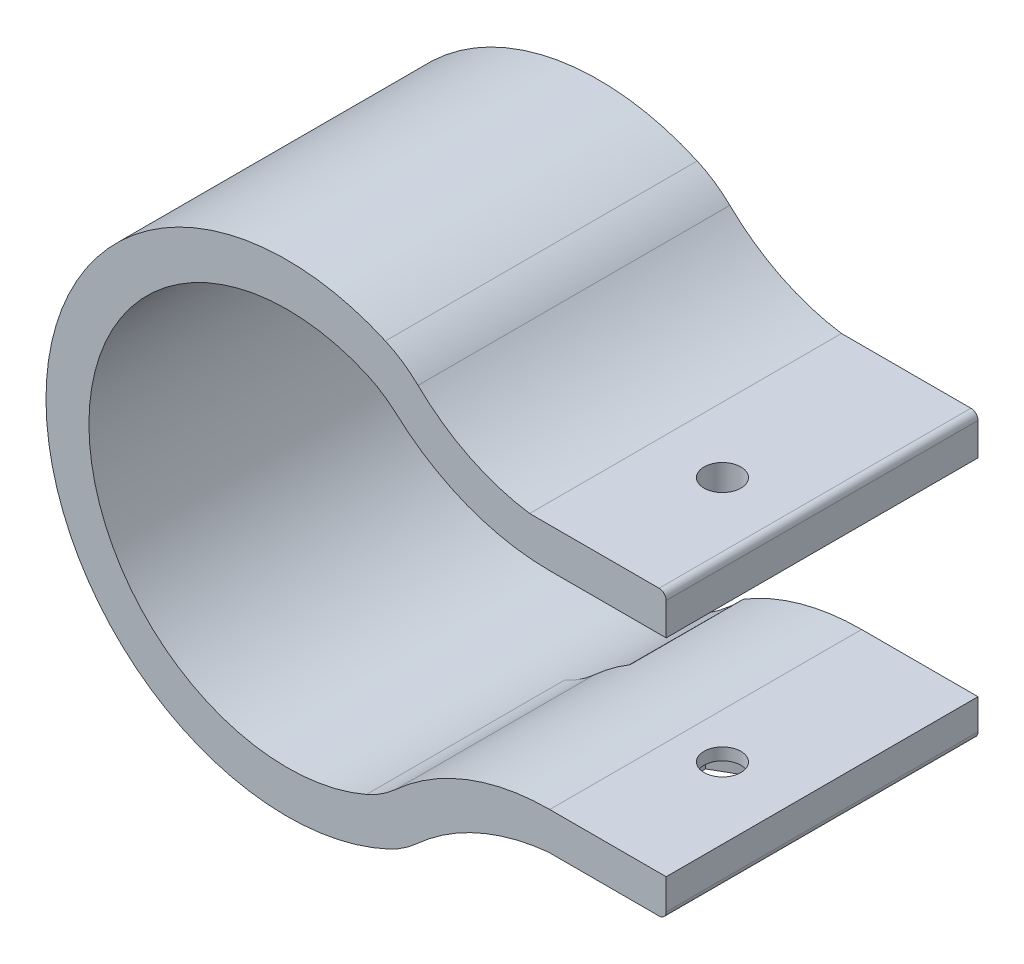
ISO-10303-21;
HEADER;
FILE_DESCRIPTION(('STEP AP214'),'2;1');
FILE_NAME('part.step','',(''),(''),'','','');
FILE_SCHEMA(('AUTOMOTIVE_DESIGN { 1 0 10303 214 1 1 1 1 }'));
ENDSEC;
DATA;
#1=APPLICATION_CONTEXT('core data for automotive mechanical design processes');
#2=APPLICATION_PROTOCOL_DEFINITION('international standard','automotive_design',2000,#1);
#3=PRODUCT_CONTEXT('',#1,'mechanical');
#4=PRODUCT('Part','Part','',(#3));
#5=PRODUCT_RELATED_PRODUCT_CATEGORY('part','',(#4));
#6=PRODUCT_DEFINITION_FORMATION('','',#4);
#7=PRODUCT_DEFINITION_CONTEXT('part definition',#1,'design');
#8=PRODUCT_DEFINITION('design','',#6,#7);
#9=PRODUCT_DEFINITION_SHAPE('','',#8);
#10=(LENGTH_UNIT() NAMED_UNIT(*) SI_UNIT(.MILLI.,.METRE.));
#11=(NAMED_UNIT(*) PLANE_ANGLE_UNIT() SI_UNIT($,.RADIAN.));
#12=(NAMED_UNIT(*) SI_UNIT($,.STERADIAN.) SOLID_ANGLE_UNIT());
#13=UNCERTAINTY_MEASURE_WITH_UNIT(LENGTH_MEASURE(1.E-05),#10,'distance_accuracy_value','');
#14=(GEOMETRIC_REPRESENTATION_CONTEXT(3) GLOBAL_UNCERTAINTY_ASSIGNED_CONTEXT((#13)) GLOBAL_UNIT_ASSIGNED_CONTEXT((#10,
#11,#12)) REPRESENTATION_CONTEXT('',''));
#15=CARTESIAN_POINT('',(0.,0.,0.));
#16=DIRECTION('',(0.,0.,1.));
#17=DIRECTION('',(1.,0.,0.));
#18=AXIS2_PLACEMENT_3D('',#15,#16,#17);
#19=CARTESIAN_POINT('',(0.,0.,0.));
#20=DIRECTION('',(0.,0.,1.));
#21=DIRECTION('',(1.,0.,0.));
#22=AXIS2_PLACEMENT_3D('',#19,#20,#21);
#23=PLANE('',#22);
#24=CARTESIAN_POINT('',(0.,0.,0.));
#25=DIRECTION('',(0.,0.,1.));
#26=DIRECTION('',(1.,0.,0.));
#27=AXIS2_PLACEMENT_3D('',#24,#25,#26);
#28=CIRCLE('',#27,14.);
#29=CARTESIAN_POINT('',(10.1763233301614,9.61469934423397,0.));
#30=VERTEX_POINT('',#29);
#31=CARTESIAN_POINT('',(5.5819491316693,12.8390748845646,0.));
#32=VERTEX_POINT('',#31);
#33=EDGE_CURVE('E182',#30,#32,#28,.T.);
#34=ORIENTED_EDGE('',*,*,#33,.F.);
#35=CARTESIAN_POINT('',(18.5109838464994,23.4286105601288,0.));
#36=DIRECTION('',(0.,0.,1.));
#37=DIRECTION('',(1.,0.,0.));
#38=AXIS2_PLACEMENT_3D('',#35,#36,#37);
#39=CIRCLE('',#38,16.1335274817143);
#40=CARTESIAN_POINT('',(7.64356227458687,11.504271694533,0.));
#41=VERTEX_POINT('',#40);
#42=EDGE_CURVE('E11',#41,#30,#39,.T.);
#43=ORIENTED_EDGE('',*,*,#42,.F.);
#44=CARTESIAN_POINT('',(2.59161923970361,5.96099905354783,0.));
#45=DIRECTION('',(0.,0.,1.));
#46=DIRECTION('',(1.,0.,0.));
#47=AXIS2_PLACEMENT_3D('',#44,#45,#46);
#48=CIRCLE('',#47,7.5);
#49=EDGE_CURVE('E272',#41,#32,#48,.T.);
#50=ORIENTED_EDGE('',*,*,#49,.T.);
#51=EDGE_LOOP('',(#34,#43,#50));
#52=FACE_BOUND('',#51,.T.);
#53=ADVANCED_FACE('F17',(#52),#23,.F.);
#54=CARTESIAN_POINT('',(2.59161923970361,-5.96099905354782,0.));
#55=DIRECTION('',(0.,0.,1.));
#56=DIRECTION('',(1.,0.,0.));
#57=AXIS2_PLACEMENT_3D('',#54,#55,#56);
#58=CIRCLE('',#57,7.5);
#59=CARTESIAN_POINT('',(5.58194913166929,-12.8390748845646,0.));
#60=VERTEX_POINT('',#59);
#61=CARTESIAN_POINT('',(7.64356227458687,-11.504271694533,0.));
#62=VERTEX_POINT('',#61);
#63=EDGE_CURVE('E266',#60,#62,#58,.T.);
#64=ORIENTED_EDGE('',*,*,#63,.T.);
#65=CARTESIAN_POINT('',(18.5109838464994,-23.4286105601288,0.));
#66=DIRECTION('',(0.,0.,1.));
#67=DIRECTION('',(1.,0.,0.));
#68=AXIS2_PLACEMENT_3D('',#65,#66,#67);
#69=CIRCLE('',#68,16.1335274817143);
#70=CARTESIAN_POINT('',(10.1763233301614,-9.61469934423397,0.));
#71=VERTEX_POINT('',#70);
#72=EDGE_CURVE('E27',#71,#62,#69,.T.);
#73=ORIENTED_EDGE('',*,*,#72,.F.);
#74=EDGE_CURVE('E194',#60,#71,#28,.T.);
#75=ORIENTED_EDGE('',*,*,#74,.F.);
#76=EDGE_LOOP('',(#64,#73,#75));
#77=FACE_BOUND('',#76,.T.);
#78=ADVANCED_FACE('F552',(#77),#23,.F.);
#79=CARTESIAN_POINT('',(21.6967618307602,30.1528672788031,5.));
#80=DIRECTION('',(0.,-1.,0.));
#81=DIRECTION('',(0.,0.,-1.));
#82=AXIS2_PLACEMENT_3D('',#79,#80,#81);
#83=CYLINDRICAL_SURFACE('',#82,1.3);
#84=CARTESIAN_POINT('',(21.6967618307602,-7.29508307841454,5.));
#85=DIRECTION('',(0.,1.,0.));
#86=DIRECTION('',(0.,0.,1.));
#87=AXIS2_PLACEMENT_3D('',#84,#85,#86);
#88=CIRCLE('',#87,1.3);
#89=CARTESIAN_POINT('',(21.6967618307602,-7.29508307841454,6.3));
#90=VERTEX_POINT('',#89);
#91=EDGE_CURVE('E258',#90,#90,#88,.T.);
#92=ORIENTED_EDGE('',*,*,#91,.T.);
#93=EDGE_LOOP('',(#92));
#94=FACE_BOUND('',#93,.T.);
#95=CARTESIAN_POINT('',(21.6967618307602,-8.1471327211969,5.));
#96=DIRECTION('',(0.,-1.,0.));
#97=DIRECTION('',(0.,0.,-1.));
#98=AXIS2_PLACEMENT_3D('',#95,#96,#97);
#99=CIRCLE('',#98,1.3);
#100=CARTESIAN_POINT('',(21.6967618307602,-8.1471327211969,3.7));
#101=VERTEX_POINT('',#100);
#102=EDGE_CURVE('E316',#101,#101,#99,.T.);
#103=ORIENTED_EDGE('',*,*,#102,.T.);
#104=EDGE_LOOP('',(#103));
#105=FACE_BOUND('',#104,.T.);
#106=ADVANCED_FACE('F558',(#94,#105),#83,.F.);
#107=CARTESIAN_POINT('',(19.208665614068,24.2715465258445,10.));
#108=DIRECTION('',(0.,0.,-1.));
#109=DIRECTION('',(-1.,0.,0.));
#110=AXIS2_PLACEMENT_3D('',#107,#108,#109);
#111=CYLINDRICAL_SURFACE('',#110,14.3478608179955);
#112=DIRECTION('',(0.,0.,-1.));
#113=VECTOR('',#112,1.);
#114=CARTESIAN_POINT('',(17.091626065188,10.080730707117,10.));
#115=LINE('',#114,#113);
#116=CARTESIAN_POINT('',(17.091626065188,10.080730707117,14.));
#117=VERTEX_POINT('',#116);
#118=CARTESIAN_POINT('',(17.091626065188,10.080730707117,-8.));
#119=VERTEX_POINT('',#118);
#120=EDGE_CURVE('E391',#117,#119,#115,.T.);
#121=ORIENTED_EDGE('',*,*,#120,.T.);
#122=CARTESIAN_POINT('',(19.208665614068,24.2715465258445,-8.));
#123=DIRECTION('',(0.,0.,1.));
#124=DIRECTION('',(1.,0.,0.));
#125=AXIS2_PLACEMENT_3D('',#122,#123,#124);
#126=CIRCLE('',#125,14.3478608179955);
#127=CARTESIAN_POINT('',(9.2182340260635,13.9733725742174,-8.));
#128=VERTEX_POINT('',#127);
#129=EDGE_CURVE('E211',#128,#119,#126,.T.);
#130=ORIENTED_EDGE('',*,*,#129,.F.);
#131=DIRECTION('',(0.,0.,-1.));
#132=VECTOR('',#131,1.);
#133=CARTESIAN_POINT('',(9.2182340260635,13.9733725742174,10.));
#134=LINE('',#133,#132);
#135=CARTESIAN_POINT('',(9.2182340260635,13.9733725742174,14.));
#136=VERTEX_POINT('',#135);
#137=EDGE_CURVE('E236',#128,#136,#134,.F.);
#138=ORIENTED_EDGE('',*,*,#137,.T.);
#139=CARTESIAN_POINT('',(19.208665614068,24.2715465258445,14.));
#140=DIRECTION('',(0.,0.,1.));
#141=DIRECTION('',(1.,0.,0.));
#142=AXIS2_PLACEMENT_3D('',#139,#140,#141);
#143=CIRCLE('',#142,14.3478608179955);
#144=EDGE_CURVE('E232',#136,#117,#143,.T.);
#145=ORIENTED_EDGE('',*,*,#144,.T.);
#146=EDGE_LOOP('',(#121,#130,#138,#145));
#147=FACE_BOUND('',#146,.T.);
#148=ADVANCED_FACE('F448',(#147),#111,.F.);
#149=CARTESIAN_POINT('',(-0.0283478622664811,0.0164030754280089,10.));
#150=DIRECTION('',(0.,0.,-1.));
#151=DIRECTION('',(-1.,0.,0.));
#152=AXIS2_PLACEMENT_3D('',#149,#150,#151);
#153=CYLINDRICAL_SURFACE('',#152,17.);
#154=DIRECTION('',(0.,0.,-1.));
#155=VECTOR('',#154,1.);
#156=CARTESIAN_POINT('',(6.91553430321997,15.5335710023352,10.));
#157=LINE('',#156,#155);
#158=CARTESIAN_POINT('',(6.91553430321997,15.5335710023352,14.));
#159=VERTEX_POINT('',#158);
#160=CARTESIAN_POINT('',(6.91553430321997,15.5335710023352,-8.));
#161=VERTEX_POINT('',#160);
#162=EDGE_CURVE('E226',#159,#161,#157,.T.);
#163=ORIENTED_EDGE('',*,*,#162,.T.);
#164=CARTESIAN_POINT('',(-0.0283478622664811,0.0164030754280089,-8.));
#165=DIRECTION('',(0.,0.,1.));
#166=DIRECTION('',(1.,0.,0.));
#167=AXIS2_PLACEMENT_3D('',#164,#165,#166);
#168=CIRCLE('',#167,17.);
#169=CARTESIAN_POINT('',(7.13028950953052,-15.4028676913467,-8.));
#170=VERTEX_POINT('',#169);
#171=EDGE_CURVE('E206',#161,#170,#168,.T.);
#172=ORIENTED_EDGE('',*,*,#171,.T.);
#173=DIRECTION('',(0.,0.,-1.));
#174=VECTOR('',#173,1.);
#175=CARTESIAN_POINT('',(7.13028950953052,-15.4028676913467,10.));
#176=LINE('',#175,#174);
#177=CARTESIAN_POINT('',(7.13028950953052,-15.4028676913467,14.));
#178=VERTEX_POINT('',#177);
#179=EDGE_CURVE('E245',#170,#178,#176,.F.);
#180=ORIENTED_EDGE('',*,*,#179,.T.);
#181=CARTESIAN_POINT('',(-0.0283478622664811,0.0164030754280089,14.));
#182=DIRECTION('',(0.,0.,1.));
#183=DIRECTION('',(1.,0.,0.));
#184=AXIS2_PLACEMENT_3D('',#181,#182,#183);
#185=CIRCLE('',#184,17.);
#186=EDGE_CURVE('E306',#159,#178,#185,.T.);
#187=ORIENTED_EDGE('',*,*,#186,.F.);
#188=EDGE_LOOP('',(#163,#172,#180,#187));
#189=FACE_BOUND('',#188,.T.);
#190=ADVANCED_FACE('F458',(#189),#153,.T.);
#191=CARTESIAN_POINT('',(20.,-26.,10.));
#192=DIRECTION('',(0.,0.,-1.));
#193=DIRECTION('',(-1.,0.,0.));
#194=AXIS2_PLACEMENT_3D('',#191,#192,#193);
#195=CYLINDRICAL_SURFACE('',#194,16.1335274817142);
#196=CARTESIAN_POINT('',(20.,-26.,14.));
#197=DIRECTION('',(0.,0.,1.));
#198=DIRECTION('',(1.,0.,0.));
#199=AXIS2_PLACEMENT_3D('',#196,#197,#198);
#200=CIRCLE('',#199,16.1335274817142);
#201=CARTESIAN_POINT('',(18.3887392723822,-9.9471327211969,14.));
#202=VERTEX_POINT('',#201);
#203=CARTESIAN_POINT('',(9.14439756186764,-14.0649003058858,14.));
#204=VERTEX_POINT('',#203);
#205=EDGE_CURVE('E302',#202,#204,#200,.T.);
#206=ORIENTED_EDGE('',*,*,#205,.T.);
#207=DIRECTION('',(0.,0.,-1.));
#208=VECTOR('',#207,1.);
#209=CARTESIAN_POINT('',(9.14439756186764,-14.0649003058858,10.));
#210=LINE('',#209,#208);
#211=CARTESIAN_POINT('',(9.14439756186764,-14.0649003058858,-8.));
#212=VERTEX_POINT('',#211);
#213=EDGE_CURVE('E240',#204,#212,#210,.T.);
#214=ORIENTED_EDGE('',*,*,#213,.T.);
#215=CARTESIAN_POINT('',(20.,-26.,-8.));
#216=DIRECTION('',(0.,0.,1.));
#217=DIRECTION('',(1.,0.,0.));
#218=AXIS2_PLACEMENT_3D('',#215,#216,#217);
#219=CIRCLE('',#218,16.1335274817142);
#220=CARTESIAN_POINT('',(18.3887392723822,-9.9471327211969,-8.));
#221=VERTEX_POINT('',#220);
#222=EDGE_CURVE('E205',#221,#212,#219,.T.);
#223=ORIENTED_EDGE('',*,*,#222,.F.);
#224=DIRECTION('',(0.,0.,-1.));
#225=VECTOR('',#224,1.);
#226=CARTESIAN_POINT('',(18.3887392723822,-9.9471327211969,10.));
#227=LINE('',#226,#225);
#228=EDGE_CURVE('E263',#202,#221,#227,.T.);
#229=ORIENTED_EDGE('',*,*,#228,.F.);
#230=EDGE_LOOP('',(#206,#214,#223,#229));
#231=FACE_BOUND('',#230,.T.);
#232=ADVANCED_FACE('F467',(#231),#195,.F.);
#233=CARTESIAN_POINT('',(21.8067618307602,-9.9471327211969,10.));
#234=DIRECTION('',(0.,-1.,0.));
#235=DIRECTION('',(0.,0.,-1.));
#236=AXIS2_PLACEMENT_3D('',#233,#234,#235);
#237=PLANE('',#236);
#238=DIRECTION('',(0.,0.,1.));
#239=VECTOR('',#238,1.);
#240=CARTESIAN_POINT('',(24.5130764438672,-9.9471327211969,5.));
#241=LINE('',#240,#239);
#242=CARTESIAN_POINT('',(24.5130764438672,-9.9471327211969,3.374));
#243=VERTEX_POINT('',#242);
#244=CARTESIAN_POINT('',(24.5130764438672,-9.9471327211969,6.626));
#245=VERTEX_POINT('',#244);
#246=EDGE_CURVE('E292',#243,#245,#241,.T.);
#247=ORIENTED_EDGE('',*,*,#246,.F.);
#248=DIRECTION('',(0.866025403784439,0.,0.5));
#249=VECTOR('',#248,1.);
#250=CARTESIAN_POINT('',(23.1049191373138,-9.9471327211969,2.561));
#251=LINE('',#250,#249);
#252=CARTESIAN_POINT('',(21.6967618307602,-9.9471327211969,1.748));
#253=VERTEX_POINT('',#252);
#254=EDGE_CURVE('E321',#253,#243,#251,.T.);
#255=ORIENTED_EDGE('',*,*,#254,.F.);
#256=DIRECTION('',(0.866025403784439,0.,-0.5));
#257=VECTOR('',#256,1.);
#258=CARTESIAN_POINT('',(20.2886045242068,-9.9471327211969,2.561));
#259=LINE('',#258,#257);
#260=CARTESIAN_POINT('',(18.8804472176533,-9.9471327211969,3.374));
#261=VERTEX_POINT('',#260);
#262=EDGE_CURVE('E361',#261,#253,#259,.T.);
#263=ORIENTED_EDGE('',*,*,#262,.F.);
#264=DIRECTION('',(0.,0.,-1.));
#265=VECTOR('',#264,1.);
#266=CARTESIAN_POINT('',(18.8804472176533,-9.9471327211969,5.));
#267=LINE('',#266,#265);
#268=CARTESIAN_POINT('',(18.8804472176533,-9.9471327211969,6.626));
#269=VERTEX_POINT('',#268);
#270=EDGE_CURVE('E357',#269,#261,#267,.T.);
#271=ORIENTED_EDGE('',*,*,#270,.F.);
#272=DIRECTION('',(-0.866025403784438,0.,-0.5));
#273=VECTOR('',#272,1.);
#274=CARTESIAN_POINT('',(20.2886045242068,-9.9471327211969,7.439));
#275=LINE('',#274,#273);
#276=CARTESIAN_POINT('',(21.6967618307602,-9.9471327211969,8.252));
#277=VERTEX_POINT('',#276);
#278=EDGE_CURVE('E353',#277,#269,#275,.T.);
#279=ORIENTED_EDGE('',*,*,#278,.F.);
#280=DIRECTION('',(-0.866025403784438,0.,0.5));
#281=VECTOR('',#280,1.);
#282=CARTESIAN_POINT('',(23.1049191373138,-9.9471327211969,7.439));
#283=LINE('',#282,#281);
#284=EDGE_CURVE('E349',#245,#277,#283,.T.);
#285=ORIENTED_EDGE('',*,*,#284,.F.);
#286=EDGE_LOOP('',(#247,#255,#263,#271,#279,#285));
#287=FACE_BOUND('',#286,.T.);
#288=DIRECTION('',(-1.,0.,0.));
#289=VECTOR('',#288,1.);
#290=CARTESIAN_POINT('',(21.8067618307602,-9.9471327211969,-8.));
#291=LINE('',#290,#289);
#292=CARTESIAN_POINT('',(26.2247843891383,-9.9471327211969,-8.));
#293=VERTEX_POINT('',#292);
#294=EDGE_CURVE('E255',#293,#221,#291,.T.);
#295=ORIENTED_EDGE('',*,*,#294,.F.);
#296=DIRECTION('',(0.,0.,-1.));
#297=VECTOR('',#296,1.);
#298=CARTESIAN_POINT('',(26.2247843891383,-9.9471327211969,10.));
#299=LINE('',#298,#297);
#300=CARTESIAN_POINT('',(26.2247843891383,-9.9471327211969,14.));
#301=VERTEX_POINT('',#300);
#302=EDGE_CURVE('E199',#293,#301,#299,.F.);
#303=ORIENTED_EDGE('',*,*,#302,.T.);
#304=DIRECTION('',(-1.,0.,0.));
#305=VECTOR('',#304,1.);
#306=CARTESIAN_POINT('',(21.8067618307602,-9.9471327211969,14.));
#307=LINE('',#306,#305);
#308=EDGE_CURVE('E299',#301,#202,#307,.T.);
#309=ORIENTED_EDGE('',*,*,#308,.T.);
#310=ORIENTED_EDGE('',*,*,#228,.T.);
#311=EDGE_LOOP('',(#295,#303,#309,#310));
#312=FACE_BOUND('',#311,.T.);
#313=ADVANCED_FACE('F471',(#287,#312),#237,.T.);
#314=CARTESIAN_POINT('',(26.7247843891382,-8.62110789980572,10.));
#315=DIRECTION('',(1.,0.,0.));
#316=DIRECTION('',(0.,0.,-1.));
#317=AXIS2_PLACEMENT_3D('',#314,#315,#316);
#318=PLANE('',#317);
#319=DIRECTION('',(0.,-1.,0.));
#320=VECTOR('',#319,1.);
#321=CARTESIAN_POINT('',(26.7247843891382,-8.62110789980572,14.));
#322=LINE('',#321,#320);
#323=CARTESIAN_POINT('',(26.7247843891382,-7.29508307841454,14.));
#324=VERTEX_POINT('',#323);
#325=CARTESIAN_POINT('',(26.7247843891382,-9.4471327211969,14.));
#326=VERTEX_POINT('',#325);
#327=EDGE_CURVE('E296',#324,#326,#322,.T.);
#328=ORIENTED_EDGE('',*,*,#327,.T.);
#329=DIRECTION('',(0.,0.,-1.));
#330=VECTOR('',#329,1.);
#331=CARTESIAN_POINT('',(26.7247843891382,-9.4471327211969,10.));
#332=LINE('',#331,#330);
#333=CARTESIAN_POINT('',(26.7247843891382,-9.4471327211969,-8.));
#334=VERTEX_POINT('',#333);
#335=EDGE_CURVE('E200',#326,#334,#332,.T.);
#336=ORIENTED_EDGE('',*,*,#335,.T.);
#337=DIRECTION('',(0.,-1.,0.));
#338=VECTOR('',#337,1.);
#339=CARTESIAN_POINT('',(26.7247843891382,-8.62110789980572,-8.));
#340=LINE('',#339,#338);
#341=CARTESIAN_POINT('',(26.7247843891382,-7.29508307841454,-8.));
#342=VERTEX_POINT('',#341);
#343=EDGE_CURVE('E167',#342,#334,#340,.T.);
#344=ORIENTED_EDGE('',*,*,#343,.F.);
#345=DIRECTION('',(0.,0.,-1.));
#346=VECTOR('',#345,1.);
#347=CARTESIAN_POINT('',(26.7247843891382,-7.29508307841454,10.));
#348=LINE('',#347,#346);
#349=EDGE_CURVE('E95',#324,#342,#348,.T.);
#350=ORIENTED_EDGE('',*,*,#349,.F.);
#351=EDGE_LOOP('',(#328,#336,#344,#350));
#352=FACE_BOUND('',#351,.T.);
#353=ADVANCED_FACE('F477',(#352),#318,.T.);
#354=CARTESIAN_POINT('',(21.7946649259442,-7.29508307841454,10.));
#355=DIRECTION('',(0.,1.,0.));
#356=DIRECTION('',(0.,0.,1.));
#357=AXIS2_PLACEMENT_3D('',#354,#355,#356);
#358=PLANE('',#357);
#359=ORIENTED_EDGE('',*,*,#91,.F.);
#360=EDGE_LOOP('',(#359));
#361=FACE_BOUND('',#360,.T.);
#362=DIRECTION('',(1.,0.,0.));
#363=VECTOR('',#362,1.);
#364=CARTESIAN_POINT('',(21.7946649259442,-7.29508307841454,-8.));
#365=LINE('',#364,#363);
#366=CARTESIAN_POINT('',(18.5109838464994,-7.29508307841454,-8.));
#367=VERTEX_POINT('',#366);
#368=EDGE_CURVE('E160',#367,#342,#365,.T.);
#369=ORIENTED_EDGE('',*,*,#368,.F.);
#370=DIRECTION('',(0.,0.,1.));
#371=VECTOR('',#370,1.);
#372=CARTESIAN_POINT('',(18.5109838464994,-7.29508307841454,10.));
#373=LINE('',#372,#371);
#374=CARTESIAN_POINT('',(18.5109838464994,-7.29508307841454,14.));
#375=VERTEX_POINT('',#374);
#376=EDGE_CURVE('E87',#375,#367,#373,.F.);
#377=ORIENTED_EDGE('',*,*,#376,.F.);
#378=DIRECTION('',(1.,0.,0.));
#379=VECTOR('',#378,1.);
#380=CARTESIAN_POINT('',(21.7946649259442,-7.29508307841454,14.));
#381=LINE('',#380,#379);
#382=EDGE_CURVE('E293',#375,#324,#381,.T.);
#383=ORIENTED_EDGE('',*,*,#382,.T.);
#384=ORIENTED_EDGE('',*,*,#349,.T.);
#385=EDGE_LOOP('',(#369,#377,#383,#384));
#386=FACE_BOUND('',#385,.T.);
#387=ADVANCED_FACE('F161',(#361,#386),#358,.T.);
#388=CARTESIAN_POINT('',(18.5109838464994,-23.4286105601288,10.));
#389=DIRECTION('',(0.,0.,1.));
#390=DIRECTION('',(1.,0.,0.));
#391=AXIS2_PLACEMENT_3D('',#388,#389,#390);
#392=CYLINDRICAL_SURFACE('',#391,16.1335274817143);
#393=DIRECTION('',(0.,0.,-1.));
#394=VECTOR('',#393,1.);
#395=CARTESIAN_POINT('',(10.1763233301614,-9.61469934423397,-4.));
#396=LINE('',#395,#394);
#397=CARTESIAN_POINT('',(10.1763233301614,-9.61469934423397,-8.));
#398=VERTEX_POINT('',#397);
#399=EDGE_CURVE('E290',#398,#71,#396,.F.);
#400=ORIENTED_EDGE('',*,*,#399,.T.);
#401=ORIENTED_EDGE('',*,*,#72,.T.);
#402=DIRECTION('',(0.,0.,1.));
#403=VECTOR('',#402,1.);
#404=CARTESIAN_POINT('',(7.64356227458687,-11.504271694533,0.));
#405=LINE('',#404,#403);
#406=CARTESIAN_POINT('',(7.64356227458687,-11.504271694533,14.));
#407=VERTEX_POINT('',#406);
#408=EDGE_CURVE('E36',#62,#407,#405,.T.);
#409=ORIENTED_EDGE('',*,*,#408,.T.);
#410=CARTESIAN_POINT('',(18.5109838464994,-23.4286105601288,14.));
#411=DIRECTION('',(0.,0.,1.));
#412=DIRECTION('',(1.,0.,0.));
#413=AXIS2_PLACEMENT_3D('',#410,#411,#412);
#414=CIRCLE('',#413,16.1335274817143);
#415=EDGE_CURVE('E173',#375,#407,#414,.T.);
#416=ORIENTED_EDGE('',*,*,#415,.F.);
#417=ORIENTED_EDGE('',*,*,#376,.T.);
#418=CARTESIAN_POINT('',(18.5109838464994,-23.4286105601288,-8.));
#419=DIRECTION('',(0.,0.,1.));
#420=DIRECTION('',(1.,0.,0.));
#421=AXIS2_PLACEMENT_3D('',#418,#419,#420);
#422=CIRCLE('',#421,16.1335274817143);
#423=EDGE_CURVE('E171',#367,#398,#422,.T.);
#424=ORIENTED_EDGE('',*,*,#423,.T.);
#425=EDGE_LOOP('',(#400,#401,#409,#416,#417,#424));
#426=FACE_BOUND('',#425,.T.);
#427=ADVANCED_FACE('F19',(#426),#392,.T.);
#428=CARTESIAN_POINT('',(0.,0.,10.));
#429=DIRECTION('',(0.,0.,-1.));
#430=DIRECTION('',(-1.,0.,0.));
#431=AXIS2_PLACEMENT_3D('',#428,#429,#430);
#432=CYLINDRICAL_SURFACE('',#431,14.);
#433=CARTESIAN_POINT('',(0.,0.,14.));
#434=DIRECTION('',(0.,0.,1.));
#435=DIRECTION('',(1.,0.,0.));
#436=AXIS2_PLACEMENT_3D('',#433,#434,#435);
#437=CIRCLE('',#436,14.);
#438=CARTESIAN_POINT('',(5.5819491316693,12.8390748845646,14.));
#439=VERTEX_POINT('',#438);
#440=CARTESIAN_POINT('',(5.58194913166932,-12.8390748845645,14.));
#441=VERTEX_POINT('',#440);
#442=EDGE_CURVE('E284',#439,#441,#437,.T.);
#443=ORIENTED_EDGE('',*,*,#442,.T.);
#444=DIRECTION('',(0.,0.,-1.));
#445=VECTOR('',#444,1.);
#446=CARTESIAN_POINT('',(5.58194913166932,-12.8390748845645,14.));
#447=LINE('',#446,#445);
#448=EDGE_CURVE('E267',#441,#60,#447,.T.);
#449=ORIENTED_EDGE('',*,*,#448,.T.);
#450=ORIENTED_EDGE('',*,*,#74,.T.);
#451=ORIENTED_EDGE('',*,*,#399,.F.);
#452=CARTESIAN_POINT('',(0.,0.,-8.));
#453=DIRECTION('',(0.,0.,1.));
#454=DIRECTION('',(1.,0.,0.));
#455=AXIS2_PLACEMENT_3D('',#452,#453,#454);
#456=CIRCLE('',#455,14.);
#457=CARTESIAN_POINT('',(10.1763233301614,9.61469934423397,-8.));
#458=VERTEX_POINT('',#457);
#459=EDGE_CURVE('E180',#458,#398,#456,.T.);
#460=ORIENTED_EDGE('',*,*,#459,.F.);
#461=DIRECTION('',(0.,0.,-1.));
#462=VECTOR('',#461,1.);
#463=CARTESIAN_POINT('',(10.1763233301614,9.61469934423397,-4.));
#464=LINE('',#463,#462);
#465=EDGE_CURVE('E254',#458,#30,#464,.F.);
#466=ORIENTED_EDGE('',*,*,#465,.T.);
#467=ORIENTED_EDGE('',*,*,#33,.T.);
#468=DIRECTION('',(0.,0.,-1.));
#469=VECTOR('',#468,1.);
#470=CARTESIAN_POINT('',(5.5819491316693,12.8390748845646,0.));
#471=LINE('',#470,#469);
#472=EDGE_CURVE('E269',#32,#439,#471,.F.);
#473=ORIENTED_EDGE('',*,*,#472,.T.);
#474=EDGE_LOOP('',(#443,#449,#450,#451,#460,#466,#467,#473));
#475=FACE_BOUND('',#474,.T.);
#476=ADVANCED_FACE('F483',(#475),#432,.F.);
#477=CARTESIAN_POINT('',(18.5109838464994,23.4286105601288,10.));
#478=DIRECTION('',(0.,0.,1.));
#479=DIRECTION('',(1.,0.,0.));
#480=AXIS2_PLACEMENT_3D('',#477,#478,#479);
#481=CYLINDRICAL_SURFACE('',#480,16.1335274817143);
#482=DIRECTION('',(0.,0.,1.));
#483=VECTOR('',#482,1.);
#484=CARTESIAN_POINT('',(18.5109838464994,7.29508307841454,10.));
#485=LINE('',#484,#483);
#486=CARTESIAN_POINT('',(18.5109838464994,7.29508307841454,14.));
#487=VERTEX_POINT('',#486);
#488=CARTESIAN_POINT('',(18.5109838464994,7.29508307841454,-8.));
#489=VERTEX_POINT('',#488);
#490=EDGE_CURVE('E21',#487,#489,#485,.F.);
#491=ORIENTED_EDGE('',*,*,#490,.F.);
#492=CARTESIAN_POINT('',(18.5109838464994,23.4286105601288,14.));
#493=DIRECTION('',(0.,0.,1.));
#494=DIRECTION('',(1.,0.,0.));
#495=AXIS2_PLACEMENT_3D('',#492,#493,#494);
#496=CIRCLE('',#495,16.1335274817143);
#497=CARTESIAN_POINT('',(7.64356227458687,11.504271694533,14.));
#498=VERTEX_POINT('',#497);
#499=EDGE_CURVE('E287',#498,#487,#496,.T.);
#500=ORIENTED_EDGE('',*,*,#499,.F.);
#501=DIRECTION('',(0.,0.,1.));
#502=VECTOR('',#501,1.);
#503=CARTESIAN_POINT('',(7.64356227458687,11.504271694533,14.));
#504=LINE('',#503,#502);
#505=EDGE_CURVE('E249',#498,#41,#504,.F.);
#506=ORIENTED_EDGE('',*,*,#505,.T.);
#507=ORIENTED_EDGE('',*,*,#42,.T.);
#508=ORIENTED_EDGE('',*,*,#465,.F.);
#509=CARTESIAN_POINT('',(18.5109838464994,23.4286105601288,-8.));
#510=DIRECTION('',(0.,0.,1.));
#511=DIRECTION('',(1.,0.,0.));
#512=AXIS2_PLACEMENT_3D('',#509,#510,#511);
#513=CIRCLE('',#512,16.1335274817143);
#514=EDGE_CURVE('E189',#458,#489,#513,.T.);
#515=ORIENTED_EDGE('',*,*,#514,.T.);
#516=EDGE_LOOP('',(#491,#500,#506,#507,#508,#515));
#517=FACE_BOUND('',#516,.T.);
#518=ADVANCED_FACE('F568',(#517),#481,.T.);
#519=CARTESIAN_POINT('',(21.7946649259442,7.29508307841454,10.));
#520=DIRECTION('',(0.,1.,0.));
#521=DIRECTION('',(0.,0.,1.));
#522=AXIS2_PLACEMENT_3D('',#519,#520,#521);
#523=PLANE('',#522);
#524=CARTESIAN_POINT('',(21.6967618307602,7.29508307841454,5.));
#525=DIRECTION('',(0.,1.,0.));
#526=DIRECTION('',(0.,0.,1.));
#527=AXIS2_PLACEMENT_3D('',#524,#525,#526);
#528=CIRCLE('',#527,1.3);
#529=CARTESIAN_POINT('',(21.6967618307602,7.29508307841454,6.3));
#530=VERTEX_POINT('',#529);
#531=EDGE_CURVE('E386',#530,#530,#528,.T.);
#532=ORIENTED_EDGE('',*,*,#531,.T.);
#533=EDGE_LOOP('',(#532));
#534=FACE_BOUND('',#533,.T.);
#535=ORIENTED_EDGE('',*,*,#490,.T.);
#536=DIRECTION('',(1.,0.,0.));
#537=VECTOR('',#536,1.);
#538=CARTESIAN_POINT('',(21.7946649259442,7.29508307841454,-8.));
#539=LINE('',#538,#537);
#540=CARTESIAN_POINT('',(26.7247843891382,7.29508307841454,-8.));
#541=VERTEX_POINT('',#540);
#542=EDGE_CURVE('E166',#489,#541,#539,.T.);
#543=ORIENTED_EDGE('',*,*,#542,.T.);
#544=DIRECTION('',(0.,0.,-1.));
#545=VECTOR('',#544,1.);
#546=CARTESIAN_POINT('',(26.7247843891382,7.29508307841454,10.));
#547=LINE('',#546,#545);
#548=CARTESIAN_POINT('',(26.7247843891382,7.29508307841454,14.));
#549=VERTEX_POINT('',#548);
#550=EDGE_CURVE('E394',#549,#541,#547,.T.);
#551=ORIENTED_EDGE('',*,*,#550,.F.);
#552=DIRECTION('',(1.,0.,0.));
#553=VECTOR('',#552,1.);
#554=CARTESIAN_POINT('',(21.7946649259442,7.29508307841454,14.));
#555=LINE('',#554,#553);
#556=EDGE_CURVE('E409',#487,#549,#555,.T.);
#557=ORIENTED_EDGE('',*,*,#556,.F.);
#558=EDGE_LOOP('',(#535,#543,#551,#557));
#559=FACE_BOUND('',#558,.T.);
#560=ADVANCED_FACE('F431',(#534,#559),#523,.F.);
#561=CARTESIAN_POINT('',(26.7247843891382,8.68790689276577,10.));
#562=DIRECTION('',(-1.,0.,0.));
#563=DIRECTION('',(0.,0.,1.));
#564=AXIS2_PLACEMENT_3D('',#561,#562,#563);
#565=PLANE('',#564);
#566=DIRECTION('',(0.,1.,0.));
#567=VECTOR('',#566,1.);
#568=CARTESIAN_POINT('',(26.7247843891382,8.68790689276577,-8.));
#569=LINE('',#568,#567);
#570=CARTESIAN_POINT('',(26.7247843891382,9.58073070711699,-8.));
#571=VERTEX_POINT('',#570);
#572=EDGE_CURVE('E218',#541,#571,#569,.T.);
#573=ORIENTED_EDGE('',*,*,#572,.T.);
#574=DIRECTION('',(0.,0.,-1.));
#575=VECTOR('',#574,1.);
#576=CARTESIAN_POINT('',(26.7247843891382,9.58073070711699,10.));
#577=LINE('',#576,#575);
#578=CARTESIAN_POINT('',(26.7247843891382,9.58073070711699,14.));
#579=VERTEX_POINT('',#578);
#580=EDGE_CURVE('E214',#571,#579,#577,.F.);
#581=ORIENTED_EDGE('',*,*,#580,.T.);
#582=DIRECTION('',(0.,1.,0.));
#583=VECTOR('',#582,1.);
#584=CARTESIAN_POINT('',(26.7247843891382,8.68790689276577,14.));
#585=LINE('',#584,#583);
#586=EDGE_CURVE('E419',#549,#579,#585,.T.);
#587=ORIENTED_EDGE('',*,*,#586,.F.);
#588=ORIENTED_EDGE('',*,*,#550,.T.);
#589=EDGE_LOOP('',(#573,#581,#587,#588));
#590=FACE_BOUND('',#589,.T.);
#591=ADVANCED_FACE('F434',(#590),#565,.F.);
#592=CARTESIAN_POINT('',(21.1582052271631,10.080730707117,10.));
#593=DIRECTION('',(0.,-1.,0.));
#594=DIRECTION('',(0.,0.,-1.));
#595=AXIS2_PLACEMENT_3D('',#592,#593,#594);
#596=PLANE('',#595);
#597=CARTESIAN_POINT('',(21.6967618307602,10.080730707117,5.));
#598=DIRECTION('',(0.,-1.,0.));
#599=DIRECTION('',(0.,0.,-1.));
#600=AXIS2_PLACEMENT_3D('',#597,#598,#599);
#601=CIRCLE('',#600,1.3);
#602=CARTESIAN_POINT('',(21.6967618307602,10.080730707117,3.7));
#603=VERTEX_POINT('',#602);
#604=EDGE_CURVE('E385',#603,#603,#601,.T.);
#605=ORIENTED_EDGE('',*,*,#604,.T.);
#606=EDGE_LOOP('',(#605));
#607=FACE_BOUND('',#606,.T.);
#608=DIRECTION('',(-1.,0.,0.));
#609=VECTOR('',#608,1.);
#610=CARTESIAN_POINT('',(21.1582052271631,10.080730707117,14.));
#611=LINE('',#610,#609);
#612=CARTESIAN_POINT('',(26.2247843891383,10.080730707117,14.));
#613=VERTEX_POINT('',#612);
#614=EDGE_CURVE('E395',#613,#117,#611,.T.);
#615=ORIENTED_EDGE('',*,*,#614,.F.);
#616=DIRECTION('',(0.,0.,-1.));
#617=VECTOR('',#616,1.);
#618=CARTESIAN_POINT('',(26.2247843891383,10.080730707117,10.));
#619=LINE('',#618,#617);
#620=CARTESIAN_POINT('',(26.2247843891383,10.080730707117,-8.));
#621=VERTEX_POINT('',#620);
#622=EDGE_CURVE('E215',#613,#621,#619,.T.);
#623=ORIENTED_EDGE('',*,*,#622,.T.);
#624=DIRECTION('',(-1.,0.,0.));
#625=VECTOR('',#624,1.);
#626=CARTESIAN_POINT('',(21.1582052271631,10.080730707117,-8.));
#627=LINE('',#626,#625);
#628=EDGE_CURVE('E222',#621,#119,#627,.T.);
#629=ORIENTED_EDGE('',*,*,#628,.T.);
#630=ORIENTED_EDGE('',*,*,#120,.F.);
#631=EDGE_LOOP('',(#615,#623,#629,#630));
#632=FACE_BOUND('',#631,.T.);
#633=ADVANCED_FACE('F443',(#607,#632),#596,.F.);
#634=CARTESIAN_POINT('',(0.,0.,14.));
#635=DIRECTION('',(0.,0.,1.));
#636=DIRECTION('',(1.,0.,0.));
#637=AXIS2_PLACEMENT_3D('',#634,#635,#636);
#638=PLANE('',#637);
#639=ORIENTED_EDGE('',*,*,#186,.T.);
#640=CARTESIAN_POINT('',(3.76151898162605,-8.14674027168798,14.));
#641=DIRECTION('',(0.,0.,1.));
#642=DIRECTION('',(1.,0.,0.));
#643=AXIS2_PLACEMENT_3D('',#640,#641,#642);
#644=CIRCLE('',#643,8.);
#645=EDGE_CURVE('E247',#178,#204,#644,.T.);
#646=ORIENTED_EDGE('',*,*,#645,.T.);
#647=ORIENTED_EDGE('',*,*,#205,.F.);
#648=ORIENTED_EDGE('',*,*,#308,.F.);
#649=CARTESIAN_POINT('',(26.2247843891383,-9.4471327211969,14.));
#650=DIRECTION('',(0.,0.,1.));
#651=DIRECTION('',(1.,0.,0.));
#652=AXIS2_PLACEMENT_3D('',#649,#650,#651);
#653=CIRCLE('',#652,0.5);
#654=EDGE_CURVE('E229',#301,#326,#653,.T.);
#655=ORIENTED_EDGE('',*,*,#654,.T.);
#656=ORIENTED_EDGE('',*,*,#327,.F.);
#657=ORIENTED_EDGE('',*,*,#382,.F.);
#658=ORIENTED_EDGE('',*,*,#415,.T.);
#659=CARTESIAN_POINT('',(2.5916192397036,-5.96099905354783,14.));
#660=DIRECTION('',(0.,0.,1.));
#661=DIRECTION('',(1.,0.,0.));
#662=AXIS2_PLACEMENT_3D('',#659,#660,#661);
#663=CIRCLE('',#662,7.5);
#664=EDGE_CURVE('E310',#407,#441,#663,.F.);
#665=ORIENTED_EDGE('',*,*,#664,.T.);
#666=ORIENTED_EDGE('',*,*,#442,.F.);
#667=CARTESIAN_POINT('',(2.59161923970361,5.96099905354783,14.));
#668=DIRECTION('',(0.,0.,1.));
#669=DIRECTION('',(1.,0.,0.));
#670=AXIS2_PLACEMENT_3D('',#667,#668,#669);
#671=CIRCLE('',#670,7.5);
#672=EDGE_CURVE('E279',#439,#498,#671,.F.);
#673=ORIENTED_EDGE('',*,*,#672,.T.);
#674=ORIENTED_EDGE('',*,*,#499,.T.);
#675=ORIENTED_EDGE('',*,*,#556,.T.);
#676=ORIENTED_EDGE('',*,*,#586,.T.);
#677=CARTESIAN_POINT('',(26.2247843891383,9.58073070711699,14.));
#678=DIRECTION('',(0.,0.,1.));
#679=DIRECTION('',(1.,0.,0.));
#680=AXIS2_PLACEMENT_3D('',#677,#678,#679);
#681=CIRCLE('',#680,0.5);
#682=EDGE_CURVE('E224',#579,#613,#681,.T.);
#683=ORIENTED_EDGE('',*,*,#682,.T.);
#684=ORIENTED_EDGE('',*,*,#614,.T.);
#685=ORIENTED_EDGE('',*,*,#144,.F.);
#686=CARTESIAN_POINT('',(3.64782504887341,8.2313743308495,14.));
#687=DIRECTION('',(0.,0.,1.));
#688=DIRECTION('',(1.,0.,0.));
#689=AXIS2_PLACEMENT_3D('',#686,#687,#688);
#690=CIRCLE('',#689,8.);
#691=EDGE_CURVE('E238',#136,#159,#690,.T.);
#692=ORIENTED_EDGE('',*,*,#691,.T.);
#693=EDGE_LOOP('',(#639,#646,#647,#648,#655,#656,#657,#658,#665,#666,#673,#674,#675,#676,#683,
#684,#685,#692));
#694=FACE_BOUND('',#693,.T.);
#695=ADVANCED_FACE('F427',(#694),#638,.T.);
#696=CARTESIAN_POINT('',(0.,0.,-8.));
#697=DIRECTION('',(0.,0.,1.));
#698=DIRECTION('',(1.,0.,0.));
#699=AXIS2_PLACEMENT_3D('',#696,#697,#698);
#700=PLANE('',#699);
#701=ORIENTED_EDGE('',*,*,#542,.F.);
#702=ORIENTED_EDGE('',*,*,#514,.F.);
#703=ORIENTED_EDGE('',*,*,#459,.T.);
#704=ORIENTED_EDGE('',*,*,#423,.F.);
#705=ORIENTED_EDGE('',*,*,#368,.T.);
#706=ORIENTED_EDGE('',*,*,#343,.T.);
#707=CARTESIAN_POINT('',(26.2247843891383,-9.4471327211969,-8.));
#708=DIRECTION('',(0.,0.,1.));
#709=DIRECTION('',(1.,0.,0.));
#710=AXIS2_PLACEMENT_3D('',#707,#708,#709);
#711=CIRCLE('',#710,0.5);
#712=EDGE_CURVE('E197',#334,#293,#711,.F.);
#713=ORIENTED_EDGE('',*,*,#712,.T.);
#714=ORIENTED_EDGE('',*,*,#294,.T.);
#715=ORIENTED_EDGE('',*,*,#222,.T.);
#716=CARTESIAN_POINT('',(3.76151898162605,-8.14674027168798,-8.));
#717=DIRECTION('',(0.,0.,1.));
#718=DIRECTION('',(1.,0.,0.));
#719=AXIS2_PLACEMENT_3D('',#716,#717,#718);
#720=CIRCLE('',#719,8.);
#721=EDGE_CURVE('E201',#212,#170,#720,.F.);
#722=ORIENTED_EDGE('',*,*,#721,.T.);
#723=ORIENTED_EDGE('',*,*,#171,.F.);
#724=CARTESIAN_POINT('',(3.64782504887341,8.2313743308495,-8.));
#725=DIRECTION('',(0.,0.,1.));
#726=DIRECTION('',(1.,0.,0.));
#727=AXIS2_PLACEMENT_3D('',#724,#725,#726);
#728=CIRCLE('',#727,8.);
#729=EDGE_CURVE('E207',#161,#128,#728,.F.);
#730=ORIENTED_EDGE('',*,*,#729,.T.);
#731=ORIENTED_EDGE('',*,*,#129,.T.);
#732=ORIENTED_EDGE('',*,*,#628,.F.);
#733=CARTESIAN_POINT('',(26.2247843891383,9.58073070711699,-8.));
#734=DIRECTION('',(0.,0.,1.));
#735=DIRECTION('',(1.,0.,0.));
#736=AXIS2_PLACEMENT_3D('',#733,#734,#735);
#737=CIRCLE('',#736,0.5);
#738=EDGE_CURVE('E212',#621,#571,#737,.F.);
#739=ORIENTED_EDGE('',*,*,#738,.T.);
#740=ORIENTED_EDGE('',*,*,#572,.F.);
#741=EDGE_LOOP('',(#701,#702,#703,#704,#705,#706,#713,#714,#715,#722,#723,#730,#731,#732,#739,#740));
#742=FACE_BOUND('',#741,.T.);
#743=ADVANCED_FACE('F177',(#742),#700,.F.);
#744=ORIENTED_EDGE('',*,*,#604,.F.);
#745=EDGE_LOOP('',(#744));
#746=FACE_BOUND('',#745,.T.);
#747=ORIENTED_EDGE('',*,*,#531,.F.);
#748=EDGE_LOOP('',(#747));
#749=FACE_BOUND('',#748,.T.);
#750=ADVANCED_FACE('F561',(#746,#749),#83,.F.);
#751=CARTESIAN_POINT('',(24.5130764438672,-8.1471327211969,5.));
#752=DIRECTION('',(1.,0.,0.));
#753=DIRECTION('',(0.,0.,-1.));
#754=AXIS2_PLACEMENT_3D('',#751,#752,#753);
#755=PLANE('',#754);
#756=ORIENTED_EDGE('',*,*,#246,.T.);
#757=DIRECTION('',(0.,-1.,0.));
#758=VECTOR('',#757,1.);
#759=CARTESIAN_POINT('',(24.5130764438672,-8.1471327211969,6.626));
#760=LINE('',#759,#758);
#761=CARTESIAN_POINT('',(24.5130764438672,-8.1471327211969,6.626));
#762=VERTEX_POINT('',#761);
#763=EDGE_CURVE('E382',#762,#245,#760,.T.);
#764=ORIENTED_EDGE('',*,*,#763,.F.);
#765=DIRECTION('',(0.,0.,1.));
#766=VECTOR('',#765,1.);
#767=CARTESIAN_POINT('',(24.5130764438672,-8.1471327211969,5.));
#768=LINE('',#767,#766);
#769=CARTESIAN_POINT('',(24.5130764438672,-8.1471327211969,3.374));
#770=VERTEX_POINT('',#769);
#771=EDGE_CURVE('E320',#770,#762,#768,.T.);
#772=ORIENTED_EDGE('',*,*,#771,.F.);
#773=DIRECTION('',(0.,-1.,0.));
#774=VECTOR('',#773,1.);
#775=CARTESIAN_POINT('',(24.5130764438672,-8.1471327211969,3.374));
#776=LINE('',#775,#774);
#777=EDGE_CURVE('E345',#770,#243,#776,.T.);
#778=ORIENTED_EDGE('',*,*,#777,.T.);
#779=EDGE_LOOP('',(#756,#764,#772,#778));
#780=FACE_BOUND('',#779,.T.);
#781=ADVANCED_FACE('F518',(#780),#755,.F.);
#782=CARTESIAN_POINT('',(23.1049191373138,-8.1471327211969,7.439));
#783=DIRECTION('',(0.5,0.,0.866025403784438));
#784=DIRECTION('',(0.866025403784438,0.,-0.5));
#785=AXIS2_PLACEMENT_3D('',#782,#783,#784);
#786=PLANE('',#785);
#787=ORIENTED_EDGE('',*,*,#284,.T.);
#788=DIRECTION('',(0.,-1.,0.));
#789=VECTOR('',#788,1.);
#790=CARTESIAN_POINT('',(21.6967618307602,-8.1471327211969,8.252));
#791=LINE('',#790,#789);
#792=CARTESIAN_POINT('',(21.6967618307602,-8.1471327211969,8.252));
#793=VERTEX_POINT('',#792);
#794=EDGE_CURVE('E379',#793,#277,#791,.T.);
#795=ORIENTED_EDGE('',*,*,#794,.F.);
#796=DIRECTION('',(-0.866025403784438,0.,0.5));
#797=VECTOR('',#796,1.);
#798=CARTESIAN_POINT('',(23.1049191373138,-8.1471327211969,7.439));
#799=LINE('',#798,#797);
#800=EDGE_CURVE('E325',#762,#793,#799,.T.);
#801=ORIENTED_EDGE('',*,*,#800,.F.);
#802=ORIENTED_EDGE('',*,*,#763,.T.);
#803=EDGE_LOOP('',(#787,#795,#801,#802));
#804=FACE_BOUND('',#803,.T.);
#805=ADVANCED_FACE('F522',(#804),#786,.F.);
#806=CARTESIAN_POINT('',(20.2886045242068,-8.1471327211969,7.439));
#807=DIRECTION('',(-0.5,0.,0.866025403784438));
#808=DIRECTION('',(0.866025403784438,0.,0.5));
#809=AXIS2_PLACEMENT_3D('',#806,#807,#808);
#810=PLANE('',#809);
#811=ORIENTED_EDGE('',*,*,#278,.T.);
#812=DIRECTION('',(0.,-1.,0.));
#813=VECTOR('',#812,1.);
#814=CARTESIAN_POINT('',(18.8804472176533,-8.1471327211969,6.626));
#815=LINE('',#814,#813);
#816=CARTESIAN_POINT('',(18.8804472176533,-8.1471327211969,6.626));
#817=VERTEX_POINT('',#816);
#818=EDGE_CURVE('E376',#817,#269,#815,.T.);
#819=ORIENTED_EDGE('',*,*,#818,.F.);
#820=DIRECTION('',(-0.866025403784438,0.,-0.5));
#821=VECTOR('',#820,1.);
#822=CARTESIAN_POINT('',(20.2886045242068,-8.1471327211969,7.439));
#823=LINE('',#822,#821);
#824=EDGE_CURVE('E329',#793,#817,#823,.T.);
#825=ORIENTED_EDGE('',*,*,#824,.F.);
#826=ORIENTED_EDGE('',*,*,#794,.T.);
#827=EDGE_LOOP('',(#811,#819,#825,#826));
#828=FACE_BOUND('',#827,.T.);
#829=ADVANCED_FACE('F536',(#828),#810,.F.);
#830=CARTESIAN_POINT('',(18.8804472176533,-8.1471327211969,5.));
#831=DIRECTION('',(-1.,0.,0.));
#832=DIRECTION('',(0.,0.,1.));
#833=AXIS2_PLACEMENT_3D('',#830,#831,#832);
#834=PLANE('',#833);
#835=ORIENTED_EDGE('',*,*,#270,.T.);
#836=DIRECTION('',(0.,-1.,0.));
#837=VECTOR('',#836,1.);
#838=CARTESIAN_POINT('',(18.8804472176533,-8.1471327211969,3.374));
#839=LINE('',#838,#837);
#840=CARTESIAN_POINT('',(18.8804472176533,-8.1471327211969,3.374));
#841=VERTEX_POINT('',#840);
#842=EDGE_CURVE('E373',#841,#261,#839,.T.);
#843=ORIENTED_EDGE('',*,*,#842,.F.);
#844=DIRECTION('',(0.,0.,-1.));
#845=VECTOR('',#844,1.);
#846=CARTESIAN_POINT('',(18.8804472176533,-8.1471327211969,5.));
#847=LINE('',#846,#845);
#848=EDGE_CURVE('E333',#817,#841,#847,.T.);
#849=ORIENTED_EDGE('',*,*,#848,.F.);
#850=ORIENTED_EDGE('',*,*,#818,.T.);
#851=EDGE_LOOP('',(#835,#843,#849,#850));
#852=FACE_BOUND('',#851,.T.);
#853=ADVANCED_FACE('F539',(#852),#834,.F.);
#854=CARTESIAN_POINT('',(20.2886045242068,-8.1471327211969,2.561));
#855=DIRECTION('',(-0.5,0.,-0.866025403784439));
#856=DIRECTION('',(-0.866025403784439,0.,0.5));
#857=AXIS2_PLACEMENT_3D('',#854,#855,#856);
#858=PLANE('',#857);
#859=ORIENTED_EDGE('',*,*,#262,.T.);
#860=DIRECTION('',(0.,-1.,0.));
#861=VECTOR('',#860,1.);
#862=CARTESIAN_POINT('',(21.6967618307602,-8.1471327211969,1.748));
#863=LINE('',#862,#861);
#864=CARTESIAN_POINT('',(21.6967618307602,-8.1471327211969,1.748));
#865=VERTEX_POINT('',#864);
#866=EDGE_CURVE('E370',#865,#253,#863,.T.);
#867=ORIENTED_EDGE('',*,*,#866,.F.);
#868=DIRECTION('',(0.866025403784439,0.,-0.5));
#869=VECTOR('',#868,1.);
#870=CARTESIAN_POINT('',(20.2886045242068,-8.1471327211969,2.561));
#871=LINE('',#870,#869);
#872=EDGE_CURVE('E337',#841,#865,#871,.T.);
#873=ORIENTED_EDGE('',*,*,#872,.F.);
#874=ORIENTED_EDGE('',*,*,#842,.T.);
#875=EDGE_LOOP('',(#859,#867,#873,#874));
#876=FACE_BOUND('',#875,.T.);
#877=ADVANCED_FACE('F541',(#876),#858,.F.);
#878=CARTESIAN_POINT('',(23.1049191373138,-8.1471327211969,2.561));
#879=DIRECTION('',(0.5,0.,-0.866025403784439));
#880=DIRECTION('',(-0.866025403784439,0.,-0.5));
#881=AXIS2_PLACEMENT_3D('',#878,#879,#880);
#882=PLANE('',#881);
#883=ORIENTED_EDGE('',*,*,#254,.T.);
#884=ORIENTED_EDGE('',*,*,#777,.F.);
#885=DIRECTION('',(0.866025403784439,0.,0.5));
#886=VECTOR('',#885,1.);
#887=CARTESIAN_POINT('',(23.1049191373138,-8.1471327211969,2.561));
#888=LINE('',#887,#886);
#889=EDGE_CURVE('E341',#865,#770,#888,.T.);
#890=ORIENTED_EDGE('',*,*,#889,.F.);
#891=ORIENTED_EDGE('',*,*,#866,.T.);
#892=EDGE_LOOP('',(#883,#884,#890,#891));
#893=FACE_BOUND('',#892,.T.);
#894=ADVANCED_FACE('F529',(#893),#882,.F.);
#895=CARTESIAN_POINT('',(0.,-8.1471327211969,0.));
#896=DIRECTION('',(0.,-1.,0.));
#897=DIRECTION('',(1.,0.,0.));
#898=AXIS2_PLACEMENT_3D('',#895,#896,#897);
#899=PLANE('',#898);
#900=ORIENTED_EDGE('',*,*,#102,.F.);
#901=EDGE_LOOP('',(#900));
#902=FACE_BOUND('',#901,.T.);
#903=ORIENTED_EDGE('',*,*,#771,.T.);
#904=ORIENTED_EDGE('',*,*,#800,.T.);
#905=ORIENTED_EDGE('',*,*,#824,.T.);
#906=ORIENTED_EDGE('',*,*,#848,.T.);
#907=ORIENTED_EDGE('',*,*,#872,.T.);
#908=ORIENTED_EDGE('',*,*,#889,.T.);
#909=EDGE_LOOP('',(#903,#904,#905,#906,#907,#908));
#910=FACE_BOUND('',#909,.T.);
#911=ADVANCED_FACE('F525',(#902,#910),#899,.T.);
#912=CARTESIAN_POINT('',(26.2247843891383,-9.4471327211969,10.));
#913=DIRECTION('',(0.,0.,-1.));
#914=DIRECTION('',(-1.,0.,0.));
#915=AXIS2_PLACEMENT_3D('',#912,#913,#914);
#916=CYLINDRICAL_SURFACE('',#915,0.5);
#917=ORIENTED_EDGE('',*,*,#654,.F.);
#918=ORIENTED_EDGE('',*,*,#302,.F.);
#919=ORIENTED_EDGE('',*,*,#712,.F.);
#920=ORIENTED_EDGE('',*,*,#335,.F.);
#921=EDGE_LOOP('',(#917,#918,#919,#920));
#922=FACE_BOUND('',#921,.T.);
#923=ADVANCED_FACE('F476',(#922),#916,.T.);
#924=CARTESIAN_POINT('',(26.2247843891383,9.58073070711699,10.));
#925=DIRECTION('',(0.,0.,-1.));
#926=DIRECTION('',(-1.,0.,0.));
#927=AXIS2_PLACEMENT_3D('',#924,#925,#926);
#928=CYLINDRICAL_SURFACE('',#927,0.5);
#929=ORIENTED_EDGE('',*,*,#682,.F.);
#930=ORIENTED_EDGE('',*,*,#580,.F.);
#931=ORIENTED_EDGE('',*,*,#738,.F.);
#932=ORIENTED_EDGE('',*,*,#622,.F.);
#933=EDGE_LOOP('',(#929,#930,#931,#932));
#934=FACE_BOUND('',#933,.T.);
#935=ADVANCED_FACE('F437',(#934),#928,.T.);
#936=CARTESIAN_POINT('',(3.64782504887341,8.2313743308495,10.));
#937=DIRECTION('',(0.,0.,1.));
#938=DIRECTION('',(1.,0.,0.));
#939=AXIS2_PLACEMENT_3D('',#936,#937,#938);
#940=CYLINDRICAL_SURFACE('',#939,8.);
#941=ORIENTED_EDGE('',*,*,#691,.F.);
#942=ORIENTED_EDGE('',*,*,#137,.F.);
#943=ORIENTED_EDGE('',*,*,#729,.F.);
#944=ORIENTED_EDGE('',*,*,#162,.F.);
#945=EDGE_LOOP('',(#941,#942,#943,#944));
#946=FACE_BOUND('',#945,.T.);
#947=ADVANCED_FACE('F454',(#946),#940,.T.);
#948=CARTESIAN_POINT('',(3.76151898162605,-8.14674027168798,10.));
#949=DIRECTION('',(0.,0.,1.));
#950=DIRECTION('',(1.,0.,0.));
#951=AXIS2_PLACEMENT_3D('',#948,#949,#950);
#952=CYLINDRICAL_SURFACE('',#951,8.);
#953=ORIENTED_EDGE('',*,*,#645,.F.);
#954=ORIENTED_EDGE('',*,*,#179,.F.);
#955=ORIENTED_EDGE('',*,*,#721,.F.);
#956=ORIENTED_EDGE('',*,*,#213,.F.);
#957=EDGE_LOOP('',(#953,#954,#955,#956));
#958=FACE_BOUND('',#957,.T.);
#959=ADVANCED_FACE('F461',(#958),#952,.T.);
#960=CARTESIAN_POINT('',(2.59161923970361,5.96099905354783,10.));
#961=DIRECTION('',(0.,0.,1.));
#962=DIRECTION('',(1.,0.,0.));
#963=AXIS2_PLACEMENT_3D('',#960,#961,#962);
#964=CYLINDRICAL_SURFACE('',#963,7.5);
#965=ORIENTED_EDGE('',*,*,#672,.F.);
#966=ORIENTED_EDGE('',*,*,#472,.F.);
#967=ORIENTED_EDGE('',*,*,#49,.F.);
#968=ORIENTED_EDGE('',*,*,#505,.F.);
#969=EDGE_LOOP('',(#965,#966,#967,#968));
#970=FACE_BOUND('',#969,.T.);
#971=ADVANCED_FACE('F591',(#970),#964,.F.);
#972=CARTESIAN_POINT('',(2.5916192397036,-5.96099905354783,10.));
#973=DIRECTION('',(0.,0.,1.));
#974=DIRECTION('',(1.,0.,0.));
#975=AXIS2_PLACEMENT_3D('',#972,#973,#974);
#976=CYLINDRICAL_SURFACE('',#975,7.5);
#977=ORIENTED_EDGE('',*,*,#664,.F.);
#978=ORIENTED_EDGE('',*,*,#408,.F.);
#979=ORIENTED_EDGE('',*,*,#63,.F.);
#980=ORIENTED_EDGE('',*,*,#448,.F.);
#981=EDGE_LOOP('',(#977,#978,#979,#980));
#982=FACE_BOUND('',#981,.T.);
#983=ADVANCED_FACE('F481',(#982),#976,.F.);
#984=CLOSED_SHELL('',(#53,#78,#106,#148,#190,#232,#313,#353,#387,#427,#476,#518,#560,#591,#633,
#695,#743,#750,#781,#805,#829,#853,#877,#894,#911,#923,#935,#947,#959,#971,#983));
#985=MANIFOLD_SOLID_BREP('B1',#984);
#986=ADVANCED_BREP_SHAPE_REPRESENTATION('',(#18,#985),#14);
#987=SHAPE_DEFINITION_REPRESENTATION(#9,#986);
ENDSEC;
END-ISO-10303-21;
